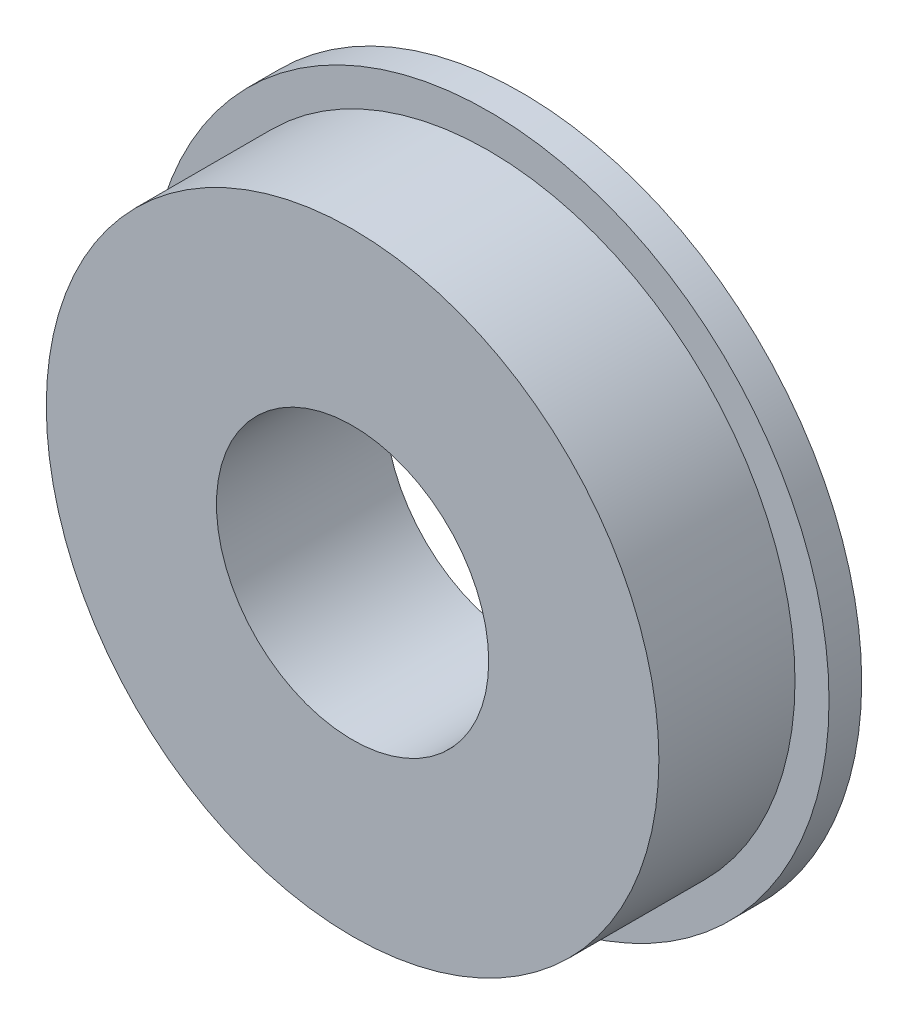
ISO-10303-21;
HEADER;
FILE_DESCRIPTION(('STEP AP214'),'2;1');
FILE_NAME('part.step','',(''),(''),'','','');
FILE_SCHEMA(('AUTOMOTIVE_DESIGN { 1 0 10303 214 1 1 1 1 }'));
ENDSEC;
DATA;
#1=APPLICATION_CONTEXT('core data for automotive mechanical design processes');
#2=APPLICATION_PROTOCOL_DEFINITION('international standard','automotive_design',2000,#1);
#3=PRODUCT_CONTEXT('',#1,'mechanical');
#4=PRODUCT('Part','Part','',(#3));
#5=PRODUCT_RELATED_PRODUCT_CATEGORY('part','',(#4));
#6=PRODUCT_DEFINITION_FORMATION('','',#4);
#7=PRODUCT_DEFINITION_CONTEXT('part definition',#1,'design');
#8=PRODUCT_DEFINITION('design','',#6,#7);
#9=PRODUCT_DEFINITION_SHAPE('','',#8);
#10=(LENGTH_UNIT() NAMED_UNIT(*) SI_UNIT(.MILLI.,.METRE.));
#11=(NAMED_UNIT(*) PLANE_ANGLE_UNIT() SI_UNIT($,.RADIAN.));
#12=(NAMED_UNIT(*) SI_UNIT($,.STERADIAN.) SOLID_ANGLE_UNIT());
#13=UNCERTAINTY_MEASURE_WITH_UNIT(LENGTH_MEASURE(1.E-05),#10,'distance_accuracy_value','');
#14=(GEOMETRIC_REPRESENTATION_CONTEXT(3) GLOBAL_UNCERTAINTY_ASSIGNED_CONTEXT((#13)) GLOBAL_UNIT_ASSIGNED_CONTEXT((#10,
#11,#12)) REPRESENTATION_CONTEXT('',''));
#15=CARTESIAN_POINT('',(0.,0.,0.));
#16=DIRECTION('',(0.,0.,1.));
#17=DIRECTION('',(1.,0.,0.));
#18=AXIS2_PLACEMENT_3D('',#15,#16,#17);
#19=CARTESIAN_POINT('',(0.,0.,1000.));
#20=DIRECTION('',(0.,0.,1.));
#21=DIRECTION('',(1.,0.,0.));
#22=AXIS2_PLACEMENT_3D('',#19,#20,#21);
#23=CYLINDRICAL_SURFACE('',#22,0.25);
#24=CARTESIAN_POINT('',(0.,0.,-0.310000000000032));
#25=DIRECTION('',(0.,0.,1.));
#26=DIRECTION('',(1.,0.,0.));
#27=AXIS2_PLACEMENT_3D('',#24,#25,#26);
#28=CIRCLE('',#27,0.25);
#29=CARTESIAN_POINT('',(0.25,0.,-0.310000000000032));
#30=VERTEX_POINT('',#29);
#31=EDGE_CURVE('E64',#30,#30,#28,.T.);
#32=ORIENTED_EDGE('',*,*,#31,.F.);
#33=EDGE_LOOP('',(#32));
#34=FACE_BOUND('',#33,.T.);
#35=CARTESIAN_POINT('',(0.,0.,0.));
#36=DIRECTION('',(0.,0.,1.));
#37=DIRECTION('',(1.,0.,0.));
#38=AXIS2_PLACEMENT_3D('',#35,#36,#37);
#39=CIRCLE('',#38,0.25);
#40=CARTESIAN_POINT('',(0.25,0.,0.));
#41=VERTEX_POINT('',#40);
#42=EDGE_CURVE('E10',#41,#41,#39,.T.);
#43=ORIENTED_EDGE('',*,*,#42,.T.);
#44=EDGE_LOOP('',(#43));
#45=FACE_BOUND('',#44,.T.);
#46=ADVANCED_FACE('F37',(#34,#45),#23,.F.);
#47=CARTESIAN_POINT('',(0.,0.25,0.));
#48=DIRECTION('',(0.,0.,-1.));
#49=DIRECTION('',(-1.,0.,0.));
#50=AXIS2_PLACEMENT_3D('',#47,#48,#49);
#51=PLANE('',#50);
#52=ORIENTED_EDGE('',*,*,#42,.F.);
#53=EDGE_LOOP('',(#52));
#54=FACE_BOUND('',#53,.T.);
#55=CARTESIAN_POINT('',(0.,0.,0.));
#56=DIRECTION('',(0.,0.,1.));
#57=DIRECTION('',(1.,0.,0.));
#58=AXIS2_PLACEMENT_3D('',#55,#56,#57);
#59=CIRCLE('',#58,0.5625);
#60=CARTESIAN_POINT('',(0.5625,0.,0.));
#61=VERTEX_POINT('',#60);
#62=EDGE_CURVE('E44',#61,#61,#59,.T.);
#63=ORIENTED_EDGE('',*,*,#62,.T.);
#64=EDGE_LOOP('',(#63));
#65=FACE_BOUND('',#64,.T.);
#66=ADVANCED_FACE('F72',(#54,#65),#51,.F.);
#67=CARTESIAN_POINT('',(0.,0.,1000.));
#68=DIRECTION('',(0.,0.,1.));
#69=DIRECTION('',(1.,0.,0.));
#70=AXIS2_PLACEMENT_3D('',#67,#68,#69);
#71=CYLINDRICAL_SURFACE('',#70,0.5625);
#72=ORIENTED_EDGE('',*,*,#62,.F.);
#73=EDGE_LOOP('',(#72));
#74=FACE_BOUND('',#73,.T.);
#75=CARTESIAN_POINT('',(0.,0.,-0.250000000000083));
#76=DIRECTION('',(0.,0.,1.));
#77=DIRECTION('',(1.,0.,0.));
#78=AXIS2_PLACEMENT_3D('',#75,#76,#77);
#79=CIRCLE('',#78,0.5625);
#80=CARTESIAN_POINT('',(0.5625,0.,-0.250000000000083));
#81=VERTEX_POINT('',#80);
#82=EDGE_CURVE('E49',#81,#81,#79,.T.);
#83=ORIENTED_EDGE('',*,*,#82,.T.);
#84=EDGE_LOOP('',(#83));
#85=FACE_BOUND('',#84,.T.);
#86=ADVANCED_FACE('F76',(#74,#85),#71,.T.);
#87=CARTESIAN_POINT('',(0.,0.5625,-0.25));
#88=DIRECTION('',(0.,0.,-1.));
#89=DIRECTION('',(-1.,0.,0.));
#90=AXIS2_PLACEMENT_3D('',#87,#88,#89);
#91=PLANE('',#90);
#92=ORIENTED_EDGE('',*,*,#82,.F.);
#93=EDGE_LOOP('',(#92));
#94=FACE_BOUND('',#93,.T.);
#95=CARTESIAN_POINT('',(0.,0.,-0.250000000000083));
#96=DIRECTION('',(0.,0.,1.));
#97=DIRECTION('',(1.,0.,0.));
#98=AXIS2_PLACEMENT_3D('',#95,#96,#97);
#99=CIRCLE('',#98,0.625);
#100=CARTESIAN_POINT('',(0.625,0.,-0.250000000000083));
#101=VERTEX_POINT('',#100);
#102=EDGE_CURVE('E54',#101,#101,#99,.T.);
#103=ORIENTED_EDGE('',*,*,#102,.T.);
#104=EDGE_LOOP('',(#103));
#105=FACE_BOUND('',#104,.T.);
#106=ADVANCED_FACE('F81',(#94,#105),#91,.F.);
#107=CARTESIAN_POINT('',(0.,0.,1000.));
#108=DIRECTION('',(0.,0.,1.));
#109=DIRECTION('',(1.,0.,0.));
#110=AXIS2_PLACEMENT_3D('',#107,#108,#109);
#111=CYLINDRICAL_SURFACE('',#110,0.625);
#112=ORIENTED_EDGE('',*,*,#102,.F.);
#113=EDGE_LOOP('',(#112));
#114=FACE_BOUND('',#113,.T.);
#115=CARTESIAN_POINT('',(0.,0.,-0.310000000000032));
#116=DIRECTION('',(0.,0.,1.));
#117=DIRECTION('',(1.,0.,0.));
#118=AXIS2_PLACEMENT_3D('',#115,#116,#117);
#119=CIRCLE('',#118,0.625);
#120=CARTESIAN_POINT('',(0.625,0.,-0.310000000000032));
#121=VERTEX_POINT('',#120);
#122=EDGE_CURVE('E60',#121,#121,#119,.T.);
#123=ORIENTED_EDGE('',*,*,#122,.T.);
#124=EDGE_LOOP('',(#123));
#125=FACE_BOUND('',#124,.T.);
#126=ADVANCED_FACE('F87',(#114,#125),#111,.T.);
#127=CARTESIAN_POINT('',(0.,0.625,-0.31));
#128=DIRECTION('',(0.,0.,1.));
#129=DIRECTION('',(1.,0.,0.));
#130=AXIS2_PLACEMENT_3D('',#127,#128,#129);
#131=PLANE('',#130);
#132=ORIENTED_EDGE('',*,*,#122,.F.);
#133=EDGE_LOOP('',(#132));
#134=FACE_BOUND('',#133,.T.);
#135=ORIENTED_EDGE('',*,*,#31,.T.);
#136=EDGE_LOOP('',(#135));
#137=FACE_BOUND('',#136,.T.);
#138=ADVANCED_FACE('F69',(#134,#137),#131,.F.);
#139=CLOSED_SHELL('',(#46,#66,#86,#106,#126,#138));
#140=MANIFOLD_SOLID_BREP('B2',#139);
#141=ADVANCED_BREP_SHAPE_REPRESENTATION('',(#18,#140),#14);
#142=SHAPE_DEFINITION_REPRESENTATION(#9,#141);
ENDSEC;
END-ISO-10303-21;
